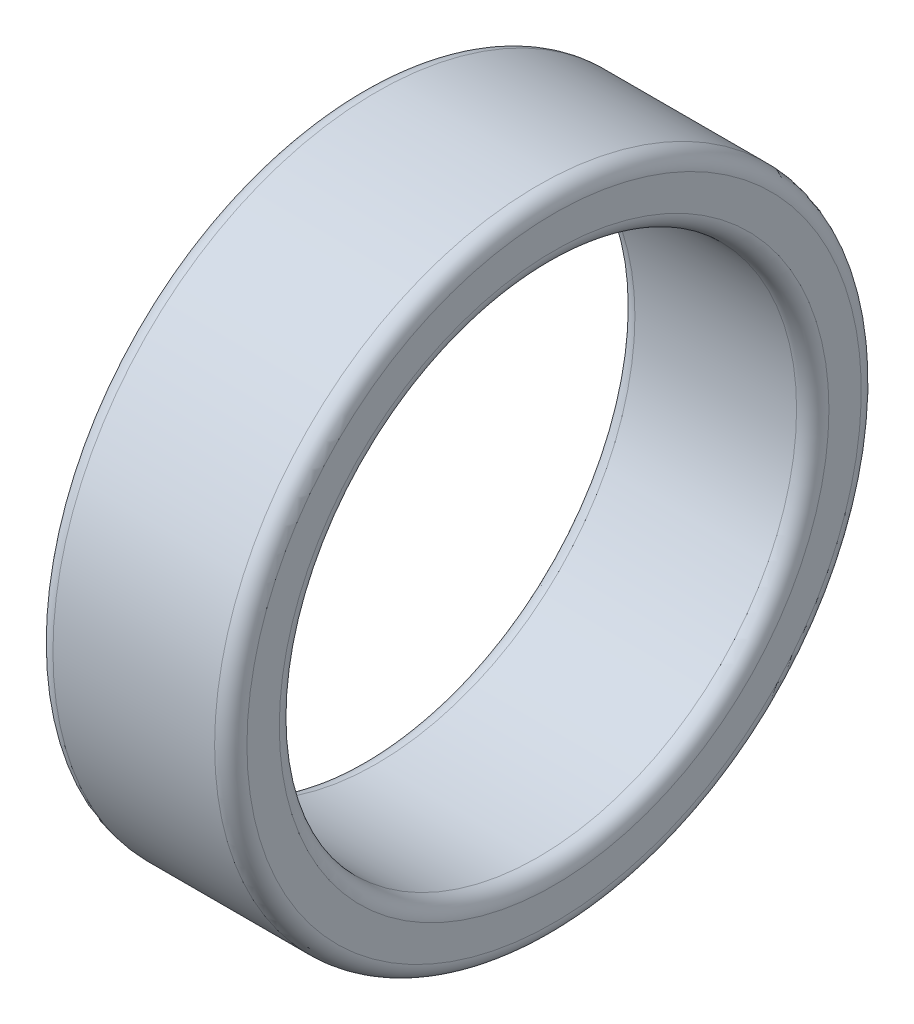
ISO-10303-21;
HEADER;
FILE_DESCRIPTION(('STEP AP214'),'2;1');
FILE_NAME('part.step','',(''),(''),'','','');
FILE_SCHEMA(('AUTOMOTIVE_DESIGN { 1 0 10303 214 1 1 1 1 }'));
ENDSEC;
DATA;
#1=APPLICATION_CONTEXT('core data for automotive mechanical design processes');
#2=APPLICATION_PROTOCOL_DEFINITION('international standard','automotive_design',2000,#1);
#3=PRODUCT_CONTEXT('',#1,'mechanical');
#4=PRODUCT('Part','Part','',(#3));
#5=PRODUCT_RELATED_PRODUCT_CATEGORY('part','',(#4));
#6=PRODUCT_DEFINITION_FORMATION('','',#4);
#7=PRODUCT_DEFINITION_CONTEXT('part definition',#1,'design');
#8=PRODUCT_DEFINITION('design','',#6,#7);
#9=PRODUCT_DEFINITION_SHAPE('','',#8);
#10=(LENGTH_UNIT() NAMED_UNIT(*) SI_UNIT(.MILLI.,.METRE.));
#11=(NAMED_UNIT(*) PLANE_ANGLE_UNIT() SI_UNIT($,.RADIAN.));
#12=(NAMED_UNIT(*) SI_UNIT($,.STERADIAN.) SOLID_ANGLE_UNIT());
#13=UNCERTAINTY_MEASURE_WITH_UNIT(LENGTH_MEASURE(1.E-05),#10,'distance_accuracy_value','');
#14=(GEOMETRIC_REPRESENTATION_CONTEXT(3) GLOBAL_UNCERTAINTY_ASSIGNED_CONTEXT((#13)) GLOBAL_UNIT_ASSIGNED_CONTEXT((#10,
#11,#12)) REPRESENTATION_CONTEXT('',''));
#15=CARTESIAN_POINT('',(0.,0.,0.));
#16=DIRECTION('',(0.,0.,1.));
#17=DIRECTION('',(1.,0.,0.));
#18=AXIS2_PLACEMENT_3D('',#15,#16,#17);
#19=CARTESIAN_POINT('',(1.25,0.,0.));
#20=DIRECTION('',(-1.,0.,0.));
#21=DIRECTION('',(0.,0.,1.));
#22=AXIS2_PLACEMENT_3D('',#19,#20,#21);
#23=TOROIDAL_SURFACE('',#22,4.75,0.25);
#24=CARTESIAN_POINT('',(1.25,0.,0.));
#25=DIRECTION('',(-1.,0.,0.));
#26=DIRECTION('',(0.,0.,1.));
#27=AXIS2_PLACEMENT_3D('',#24,#25,#26);
#28=CIRCLE('',#27,5.);
#29=CARTESIAN_POINT('',(1.25,0.,5.));
#30=VERTEX_POINT('',#29);
#31=EDGE_CURVE('E10',#30,#30,#28,.T.);
#32=ORIENTED_EDGE('',*,*,#31,.F.);
#33=EDGE_LOOP('',(#32));
#34=FACE_BOUND('',#33,.T.);
#35=CARTESIAN_POINT('',(1.5,0.,0.));
#36=DIRECTION('',(-1.,0.,0.));
#37=DIRECTION('',(0.,0.,1.));
#38=AXIS2_PLACEMENT_3D('',#35,#36,#37);
#39=CIRCLE('',#38,4.75);
#40=CARTESIAN_POINT('',(1.5,0.,4.75));
#41=VERTEX_POINT('',#40);
#42=EDGE_CURVE('E60',#41,#41,#39,.T.);
#43=ORIENTED_EDGE('',*,*,#42,.T.);
#44=EDGE_LOOP('',(#43));
#45=FACE_BOUND('',#44,.T.);
#46=ADVANCED_FACE('F32',(#34,#45),#23,.T.);
#47=CARTESIAN_POINT('',(0.,0.,0.));
#48=DIRECTION('',(-1.,0.,0.));
#49=DIRECTION('',(0.,0.,1.));
#50=AXIS2_PLACEMENT_3D('',#47,#48,#49);
#51=CYLINDRICAL_SURFACE('',#50,5.);
#52=CARTESIAN_POINT('',(-1.25,0.,0.));
#53=DIRECTION('',(-1.,0.,0.));
#54=DIRECTION('',(0.,0.,1.));
#55=AXIS2_PLACEMENT_3D('',#52,#53,#54);
#56=CIRCLE('',#55,5.);
#57=CARTESIAN_POINT('',(-1.25,0.,5.));
#58=VERTEX_POINT('',#57);
#59=EDGE_CURVE('E38',#58,#58,#56,.T.);
#60=ORIENTED_EDGE('',*,*,#59,.F.);
#61=EDGE_LOOP('',(#60));
#62=FACE_BOUND('',#61,.T.);
#63=ORIENTED_EDGE('',*,*,#31,.T.);
#64=EDGE_LOOP('',(#63));
#65=FACE_BOUND('',#64,.T.);
#66=ADVANCED_FACE('F97',(#62,#65),#51,.T.);
#67=CARTESIAN_POINT('',(-1.25,0.,0.));
#68=DIRECTION('',(-1.,0.,0.));
#69=DIRECTION('',(0.,0.,1.));
#70=AXIS2_PLACEMENT_3D('',#67,#68,#69);
#71=TOROIDAL_SURFACE('',#70,4.75,0.25);
#72=CARTESIAN_POINT('',(-1.5,0.,0.));
#73=DIRECTION('',(-1.,0.,0.));
#74=DIRECTION('',(0.,0.,1.));
#75=AXIS2_PLACEMENT_3D('',#72,#73,#74);
#76=CIRCLE('',#75,4.75);
#77=CARTESIAN_POINT('',(-1.5,0.,4.75));
#78=VERTEX_POINT('',#77);
#79=EDGE_CURVE('E42',#78,#78,#76,.T.);
#80=ORIENTED_EDGE('',*,*,#79,.F.);
#81=EDGE_LOOP('',(#80));
#82=FACE_BOUND('',#81,.T.);
#83=ORIENTED_EDGE('',*,*,#59,.T.);
#84=EDGE_LOOP('',(#83));
#85=FACE_BOUND('',#84,.T.);
#86=ADVANCED_FACE('F92',(#82,#85),#71,.T.);
#87=CARTESIAN_POINT('',(-1.5,0.,-4.75));
#88=DIRECTION('',(1.,0.,0.));
#89=DIRECTION('',(0.,0.,-1.));
#90=AXIS2_PLACEMENT_3D('',#87,#88,#89);
#91=PLANE('',#90);
#92=CARTESIAN_POINT('',(-1.5,0.,0.));
#93=DIRECTION('',(-1.,0.,0.));
#94=DIRECTION('',(0.,0.,1.));
#95=AXIS2_PLACEMENT_3D('',#92,#93,#94);
#96=CIRCLE('',#95,4.25);
#97=CARTESIAN_POINT('',(-1.5,0.,4.25));
#98=VERTEX_POINT('',#97);
#99=EDGE_CURVE('E46',#98,#98,#96,.T.);
#100=ORIENTED_EDGE('',*,*,#99,.F.);
#101=EDGE_LOOP('',(#100));
#102=FACE_BOUND('',#101,.T.);
#103=ORIENTED_EDGE('',*,*,#79,.T.);
#104=EDGE_LOOP('',(#103));
#105=FACE_BOUND('',#104,.T.);
#106=ADVANCED_FACE('F86',(#102,#105),#91,.F.);
#107=CARTESIAN_POINT('',(-1.25,0.,0.));
#108=DIRECTION('',(-1.,0.,0.));
#109=DIRECTION('',(0.,0.,1.));
#110=AXIS2_PLACEMENT_3D('',#107,#108,#109);
#111=TOROIDAL_SURFACE('',#110,4.25,0.25);
#112=CARTESIAN_POINT('',(-1.25,0.,0.));
#113=DIRECTION('',(-1.,0.,0.));
#114=DIRECTION('',(0.,0.,1.));
#115=AXIS2_PLACEMENT_3D('',#112,#113,#114);
#116=CIRCLE('',#115,4.);
#117=CARTESIAN_POINT('',(-1.25,0.,4.));
#118=VERTEX_POINT('',#117);
#119=EDGE_CURVE('E51',#118,#118,#116,.T.);
#120=ORIENTED_EDGE('',*,*,#119,.F.);
#121=EDGE_LOOP('',(#120));
#122=FACE_BOUND('',#121,.T.);
#123=ORIENTED_EDGE('',*,*,#99,.T.);
#124=EDGE_LOOP('',(#123));
#125=FACE_BOUND('',#124,.T.);
#126=ADVANCED_FACE('F80',(#122,#125),#111,.T.);
#127=CARTESIAN_POINT('',(0.,0.,0.));
#128=DIRECTION('',(-1.,0.,0.));
#129=DIRECTION('',(0.,0.,1.));
#130=AXIS2_PLACEMENT_3D('',#127,#128,#129);
#131=CYLINDRICAL_SURFACE('',#130,4.);
#132=CARTESIAN_POINT('',(1.25,0.,0.));
#133=DIRECTION('',(-1.,0.,0.));
#134=DIRECTION('',(0.,0.,1.));
#135=AXIS2_PLACEMENT_3D('',#132,#133,#134);
#136=CIRCLE('',#135,4.);
#137=CARTESIAN_POINT('',(1.25,0.,4.));
#138=VERTEX_POINT('',#137);
#139=EDGE_CURVE('E54',#138,#138,#136,.T.);
#140=ORIENTED_EDGE('',*,*,#139,.F.);
#141=EDGE_LOOP('',(#140));
#142=FACE_BOUND('',#141,.T.);
#143=ORIENTED_EDGE('',*,*,#119,.T.);
#144=EDGE_LOOP('',(#143));
#145=FACE_BOUND('',#144,.T.);
#146=ADVANCED_FACE('F74',(#142,#145),#131,.F.);
#147=CARTESIAN_POINT('',(1.25,0.,0.));
#148=DIRECTION('',(-1.,0.,0.));
#149=DIRECTION('',(0.,0.,1.));
#150=AXIS2_PLACEMENT_3D('',#147,#148,#149);
#151=TOROIDAL_SURFACE('',#150,4.25,0.25);
#152=CARTESIAN_POINT('',(1.5,0.,0.));
#153=DIRECTION('',(-1.,0.,0.));
#154=DIRECTION('',(0.,0.,1.));
#155=AXIS2_PLACEMENT_3D('',#152,#153,#154);
#156=CIRCLE('',#155,4.25);
#157=CARTESIAN_POINT('',(1.5,0.,4.25));
#158=VERTEX_POINT('',#157);
#159=EDGE_CURVE('E57',#158,#158,#156,.T.);
#160=ORIENTED_EDGE('',*,*,#159,.F.);
#161=EDGE_LOOP('',(#160));
#162=FACE_BOUND('',#161,.T.);
#163=ORIENTED_EDGE('',*,*,#139,.T.);
#164=EDGE_LOOP('',(#163));
#165=FACE_BOUND('',#164,.T.);
#166=ADVANCED_FACE('F68',(#162,#165),#151,.T.);
#167=CARTESIAN_POINT('',(1.5,0.,-4.25));
#168=DIRECTION('',(-1.,0.,0.));
#169=DIRECTION('',(0.,0.,1.));
#170=AXIS2_PLACEMENT_3D('',#167,#168,#169);
#171=PLANE('',#170);
#172=ORIENTED_EDGE('',*,*,#42,.F.);
#173=EDGE_LOOP('',(#172));
#174=FACE_BOUND('',#173,.T.);
#175=ORIENTED_EDGE('',*,*,#159,.T.);
#176=EDGE_LOOP('',(#175));
#177=FACE_BOUND('',#176,.T.);
#178=ADVANCED_FACE('F65',(#174,#177),#171,.F.);
#179=CLOSED_SHELL('',(#46,#66,#86,#106,#126,#146,#166,#178));
#180=MANIFOLD_SOLID_BREP('B2',#179);
#181=ADVANCED_BREP_SHAPE_REPRESENTATION('',(#18,#180),#14);
#182=SHAPE_DEFINITION_REPRESENTATION(#9,#181);
ENDSEC;
END-ISO-10303-21;
